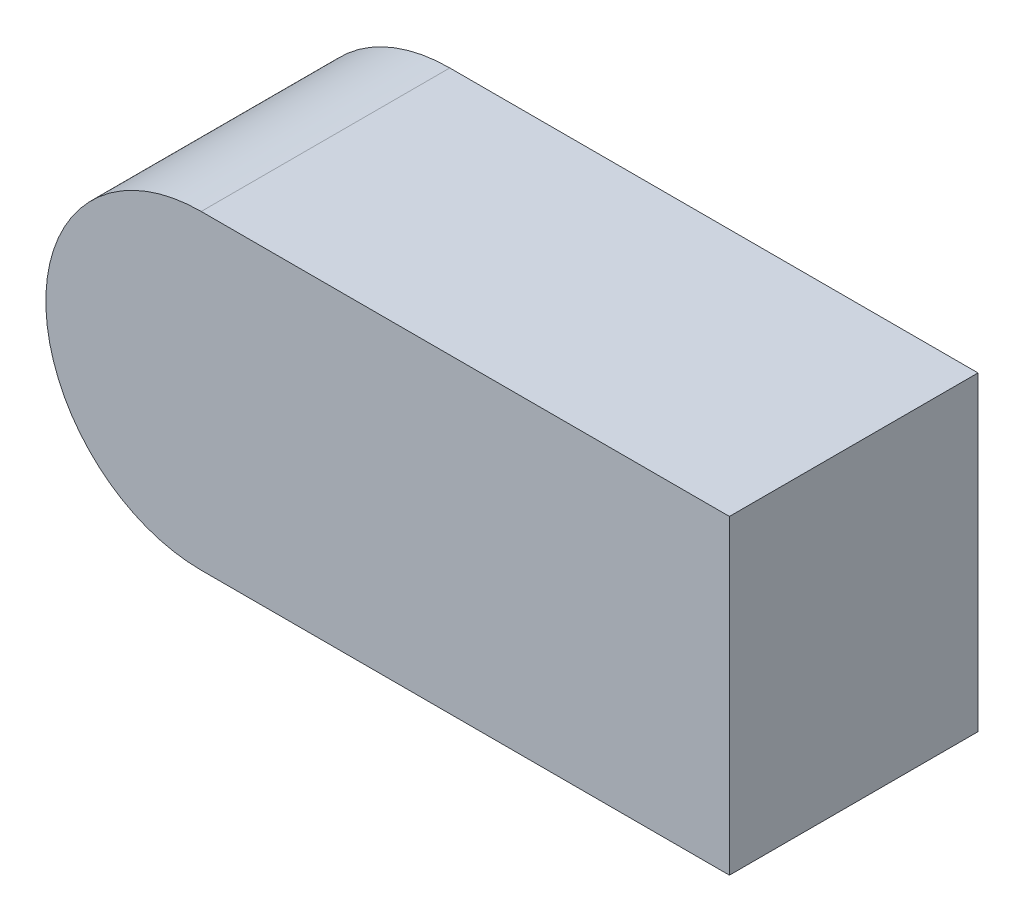
ISO-10303-21;
HEADER;
FILE_DESCRIPTION(('STEP AP214'),'2;1');
FILE_NAME('part.step','',(''),(''),'','','');
FILE_SCHEMA(('AUTOMOTIVE_DESIGN { 1 0 10303 214 1 1 1 1 }'));
ENDSEC;
DATA;
#1=APPLICATION_CONTEXT('core data for automotive mechanical design processes');
#2=APPLICATION_PROTOCOL_DEFINITION('international standard','automotive_design',2000,#1);
#3=PRODUCT_CONTEXT('',#1,'mechanical');
#4=PRODUCT('Part','Part','',(#3));
#5=PRODUCT_RELATED_PRODUCT_CATEGORY('part','',(#4));
#6=PRODUCT_DEFINITION_FORMATION('','',#4);
#7=PRODUCT_DEFINITION_CONTEXT('part definition',#1,'design');
#8=PRODUCT_DEFINITION('design','',#6,#7);
#9=PRODUCT_DEFINITION_SHAPE('','',#8);
#10=(LENGTH_UNIT() NAMED_UNIT(*) SI_UNIT(.MILLI.,.METRE.));
#11=(NAMED_UNIT(*) PLANE_ANGLE_UNIT() SI_UNIT($,.RADIAN.));
#12=(NAMED_UNIT(*) SI_UNIT($,.STERADIAN.) SOLID_ANGLE_UNIT());
#13=UNCERTAINTY_MEASURE_WITH_UNIT(LENGTH_MEASURE(1.E-05),#10,'distance_accuracy_value','');
#14=(GEOMETRIC_REPRESENTATION_CONTEXT(3) GLOBAL_UNCERTAINTY_ASSIGNED_CONTEXT((#13)) GLOBAL_UNIT_ASSIGNED_CONTEXT((#10,
#11,#12)) REPRESENTATION_CONTEXT('',''));
#15=CARTESIAN_POINT('',(0.,0.,0.));
#16=DIRECTION('',(0.,0.,1.));
#17=DIRECTION('',(1.,0.,0.));
#18=AXIS2_PLACEMENT_3D('',#15,#16,#17);
#19=CARTESIAN_POINT('',(2.075,-0.500000000000007,0.2));
#20=DIRECTION('',(0.,0.,-1.));
#21=DIRECTION('',(0.,1.,0.));
#22=AXIS2_PLACEMENT_3D('',#19,#20,#21);
#23=CYLINDRICAL_SURFACE('',#22,0.125);
#24=DIRECTION('',(0.,0.,-1.));
#25=VECTOR('',#24,1.);
#26=CARTESIAN_POINT('',(2.075,-0.625000000000008,0.2));
#27=LINE('',#26,#25);
#28=CARTESIAN_POINT('',(2.075,-0.625000000000008,0.2));
#29=VERTEX_POINT('',#28);
#30=CARTESIAN_POINT('',(2.075,-0.625000000000008,0.));
#31=VERTEX_POINT('',#30);
#32=EDGE_CURVE('E11',#29,#31,#27,.T.);
#33=ORIENTED_EDGE('',*,*,#32,.F.);
#34=CARTESIAN_POINT('',(2.075,-0.500000000000007,0.2));
#35=DIRECTION('',(0.,0.,1.));
#36=DIRECTION('',(0.,1.,0.));
#37=AXIS2_PLACEMENT_3D('',#34,#35,#36);
#38=CIRCLE('',#37,0.125);
#39=CARTESIAN_POINT('',(2.075,-0.375000000000007,0.2));
#40=VERTEX_POINT('',#39);
#41=EDGE_CURVE('E23',#40,#29,#38,.T.);
#42=ORIENTED_EDGE('',*,*,#41,.F.);
#43=DIRECTION('',(0.,0.,1.));
#44=VECTOR('',#43,1.);
#45=CARTESIAN_POINT('',(2.075,-0.375000000000007,0.2));
#46=LINE('',#45,#44);
#47=CARTESIAN_POINT('',(2.075,-0.375000000000007,0.));
#48=VERTEX_POINT('',#47);
#49=EDGE_CURVE('E87',#48,#40,#46,.T.);
#50=ORIENTED_EDGE('',*,*,#49,.F.);
#51=CARTESIAN_POINT('',(2.075,-0.500000000000007,0.));
#52=DIRECTION('',(0.,0.,-1.));
#53=DIRECTION('',(0.,1.,0.));
#54=AXIS2_PLACEMENT_3D('',#51,#52,#53);
#55=CIRCLE('',#54,0.125);
#56=EDGE_CURVE('E59',#31,#48,#55,.T.);
#57=ORIENTED_EDGE('',*,*,#56,.F.);
#58=EDGE_LOOP('',(#33,#42,#50,#57));
#59=FACE_BOUND('',#58,.T.);
#60=ADVANCED_FACE('F16',(#59),#23,.T.);
#61=CARTESIAN_POINT('',(2.5,-0.625000000000009,0.2));
#62=DIRECTION('',(0.,-1.,0.));
#63=DIRECTION('',(1.,0.,0.));
#64=AXIS2_PLACEMENT_3D('',#61,#62,#63);
#65=PLANE('',#64);
#66=DIRECTION('',(-1.,0.,0.));
#67=VECTOR('',#66,1.);
#68=CARTESIAN_POINT('',(2.5,-0.625000000000009,0.2));
#69=LINE('',#68,#67);
#70=CARTESIAN_POINT('',(2.5,-0.625000000000009,0.2));
#71=VERTEX_POINT('',#70);
#72=EDGE_CURVE('E84',#71,#29,#69,.T.);
#73=ORIENTED_EDGE('',*,*,#72,.T.);
#74=ORIENTED_EDGE('',*,*,#32,.T.);
#75=DIRECTION('',(-1.,0.,0.));
#76=VECTOR('',#75,1.);
#77=CARTESIAN_POINT('',(2.5,-0.625000000000009,0.));
#78=LINE('',#77,#76);
#79=CARTESIAN_POINT('',(2.5,-0.625000000000008,0.));
#80=VERTEX_POINT('',#79);
#81=EDGE_CURVE('E82',#80,#31,#78,.T.);
#82=ORIENTED_EDGE('',*,*,#81,.F.);
#83=DIRECTION('',(0.,0.,-1.));
#84=VECTOR('',#83,1.);
#85=CARTESIAN_POINT('',(2.5,-0.625000000000009,0.2));
#86=LINE('',#85,#84);
#87=EDGE_CURVE('E76',#71,#80,#86,.T.);
#88=ORIENTED_EDGE('',*,*,#87,.F.);
#89=EDGE_LOOP('',(#73,#74,#82,#88));
#90=FACE_BOUND('',#89,.T.);
#91=ADVANCED_FACE('F90',(#90),#65,.T.);
#92=CARTESIAN_POINT('',(0.,-0.5,0.2));
#93=DIRECTION('',(0.,0.,-1.));
#94=DIRECTION('',(0.,1.,0.));
#95=AXIS2_PLACEMENT_3D('',#92,#93,#94);
#96=PLANE('',#95);
#97=DIRECTION('',(1.,0.,0.));
#98=VECTOR('',#97,1.);
#99=CARTESIAN_POINT('',(2.5,-0.375000000000008,0.2));
#100=LINE('',#99,#98);
#101=CARTESIAN_POINT('',(2.5,-0.375000000000008,0.2));
#102=VERTEX_POINT('',#101);
#103=EDGE_CURVE('E68',#40,#102,#100,.T.);
#104=ORIENTED_EDGE('',*,*,#103,.F.);
#105=ORIENTED_EDGE('',*,*,#41,.T.);
#106=ORIENTED_EDGE('',*,*,#72,.F.);
#107=DIRECTION('',(0.,-1.,0.));
#108=VECTOR('',#107,1.);
#109=CARTESIAN_POINT('',(2.5,-0.625000000000009,0.2));
#110=LINE('',#109,#108);
#111=EDGE_CURVE('E62',#102,#71,#110,.T.);
#112=ORIENTED_EDGE('',*,*,#111,.F.);
#113=EDGE_LOOP('',(#104,#105,#106,#112));
#114=FACE_BOUND('',#113,.T.);
#115=ADVANCED_FACE('F89',(#114),#96,.F.);
#116=CARTESIAN_POINT('',(2.5,-0.375000000000008,0.2));
#117=DIRECTION('',(0.,1.,0.));
#118=DIRECTION('',(-1.,0.,0.));
#119=AXIS2_PLACEMENT_3D('',#116,#117,#118);
#120=PLANE('',#119);
#121=DIRECTION('',(1.,0.,0.));
#122=VECTOR('',#121,1.);
#123=CARTESIAN_POINT('',(2.5,-0.375000000000008,0.));
#124=LINE('',#123,#122);
#125=CARTESIAN_POINT('',(2.5,-0.375000000000008,0.));
#126=VERTEX_POINT('',#125);
#127=EDGE_CURVE('E53',#48,#126,#124,.T.);
#128=ORIENTED_EDGE('',*,*,#127,.F.);
#129=ORIENTED_EDGE('',*,*,#49,.T.);
#130=ORIENTED_EDGE('',*,*,#103,.T.);
#131=DIRECTION('',(0.,0.,-1.));
#132=VECTOR('',#131,1.);
#133=CARTESIAN_POINT('',(2.5,-0.375000000000008,0.2));
#134=LINE('',#133,#132);
#135=EDGE_CURVE('E63',#102,#126,#134,.T.);
#136=ORIENTED_EDGE('',*,*,#135,.T.);
#137=EDGE_LOOP('',(#128,#129,#130,#136));
#138=FACE_BOUND('',#137,.T.);
#139=ADVANCED_FACE('F66',(#138),#120,.T.);
#140=CARTESIAN_POINT('',(2.5,-2.5,0.9));
#141=DIRECTION('',(-1.,0.,0.));
#142=DIRECTION('',(0.,0.,1.));
#143=AXIS2_PLACEMENT_3D('',#140,#141,#142);
#144=PLANE('',#143);
#145=ORIENTED_EDGE('',*,*,#135,.F.);
#146=ORIENTED_EDGE('',*,*,#111,.T.);
#147=ORIENTED_EDGE('',*,*,#87,.T.);
#148=DIRECTION('',(0.,1.,0.));
#149=VECTOR('',#148,1.);
#150=CARTESIAN_POINT('',(2.5,-2.5,0.));
#151=LINE('',#150,#149);
#152=EDGE_CURVE('E58',#80,#126,#151,.T.);
#153=ORIENTED_EDGE('',*,*,#152,.T.);
#154=EDGE_LOOP('',(#145,#146,#147,#153));
#155=FACE_BOUND('',#154,.T.);
#156=ADVANCED_FACE('F74',(#155),#144,.F.);
#157=CARTESIAN_POINT('',(0.,0.,0.));
#158=DIRECTION('',(0.,0.,1.));
#159=DIRECTION('',(1.,0.,0.));
#160=AXIS2_PLACEMENT_3D('',#157,#158,#159);
#161=PLANE('',#160);
#162=ORIENTED_EDGE('',*,*,#152,.F.);
#163=ORIENTED_EDGE('',*,*,#81,.T.);
#164=ORIENTED_EDGE('',*,*,#56,.T.);
#165=ORIENTED_EDGE('',*,*,#127,.T.);
#166=EDGE_LOOP('',(#162,#163,#164,#165));
#167=FACE_BOUND('',#166,.T.);
#168=ADVANCED_FACE('F55',(#167),#161,.F.);
#169=CLOSED_SHELL('',(#60,#91,#115,#139,#156,#168));
#170=MANIFOLD_SOLID_BREP('B1',#169);
#171=ADVANCED_BREP_SHAPE_REPRESENTATION('',(#18,#170),#14);
#172=SHAPE_DEFINITION_REPRESENTATION(#9,#171);
ENDSEC;
END-ISO-10303-21;
